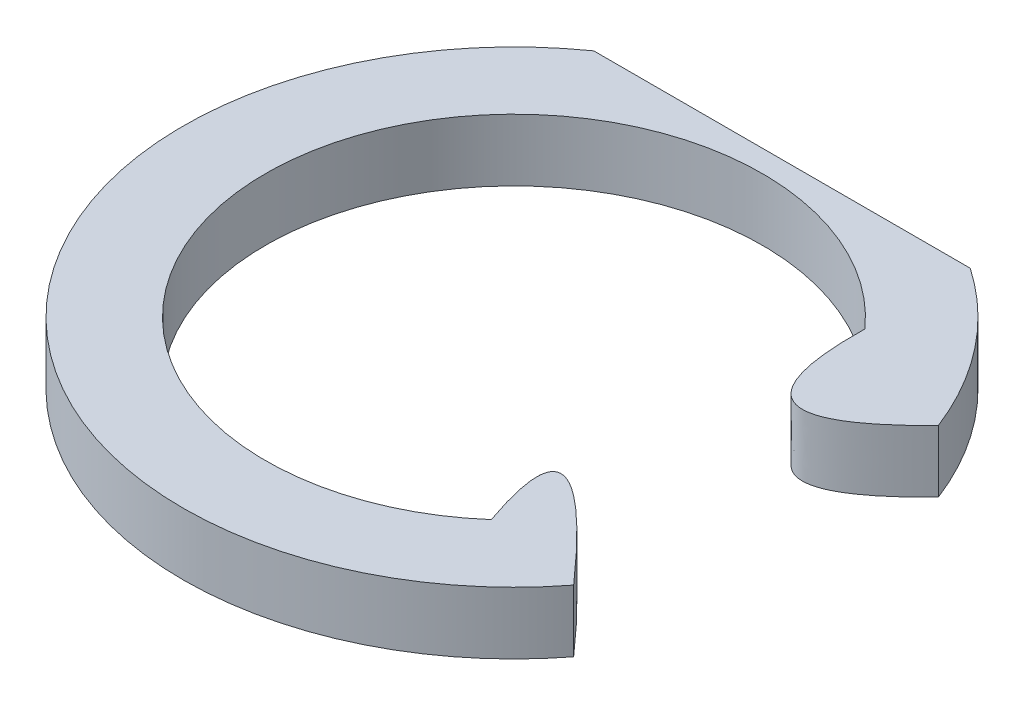
ISO-10303-21;
HEADER;
FILE_DESCRIPTION(('STEP AP214'),'2;1');
FILE_NAME('part.step','',(''),(''),'','','');
FILE_SCHEMA(('AUTOMOTIVE_DESIGN { 1 0 10303 214 1 1 1 1 }'));
ENDSEC;
DATA;
#1=APPLICATION_CONTEXT('core data for automotive mechanical design processes');
#2=APPLICATION_PROTOCOL_DEFINITION('international standard','automotive_design',2000,#1);
#3=PRODUCT_CONTEXT('',#1,'mechanical');
#4=PRODUCT('Part','Part','',(#3));
#5=PRODUCT_RELATED_PRODUCT_CATEGORY('part','',(#4));
#6=PRODUCT_DEFINITION_FORMATION('','',#4);
#7=PRODUCT_DEFINITION_CONTEXT('part definition',#1,'design');
#8=PRODUCT_DEFINITION('design','',#6,#7);
#9=PRODUCT_DEFINITION_SHAPE('','',#8);
#10=(LENGTH_UNIT() NAMED_UNIT(*) SI_UNIT(.MILLI.,.METRE.));
#11=(NAMED_UNIT(*) PLANE_ANGLE_UNIT() SI_UNIT($,.RADIAN.));
#12=(NAMED_UNIT(*) SI_UNIT($,.STERADIAN.) SOLID_ANGLE_UNIT());
#13=UNCERTAINTY_MEASURE_WITH_UNIT(LENGTH_MEASURE(1.E-05),#10,'distance_accuracy_value','');
#14=(GEOMETRIC_REPRESENTATION_CONTEXT(3) GLOBAL_UNCERTAINTY_ASSIGNED_CONTEXT((#13)) GLOBAL_UNIT_ASSIGNED_CONTEXT((#10,
#11,#12)) REPRESENTATION_CONTEXT('',''));
#15=CARTESIAN_POINT('',(0.,0.,0.));
#16=DIRECTION('',(0.,0.,1.));
#17=DIRECTION('',(1.,0.,0.));
#18=AXIS2_PLACEMENT_3D('',#15,#16,#17);
#19=CARTESIAN_POINT('',(9.24111421929395,-1.75,10.5167394179928));
#20=CARTESIAN_POINT('',(6.17315719615622,-1.75,1.69001653328734));
#21=CARTESIAN_POINT('',(14.7536304572527,-1.75,11.3915956316099));
#22=B_SPLINE_CURVE_WITH_KNOTS('',2,(#19,#20,#21),.UNSPECIFIED.,.F.,.F.,(3,3),(0.,1.),.UNSPECIFIED.);
#23=DIRECTION('',(0.,1.,0.));
#24=VECTOR('',#23,1.);
#25=SURFACE_OF_LINEAR_EXTRUSION('',#22,#24);
#26=CARTESIAN_POINT('',(9.24111421929395,1.75,10.5167394179928));
#27=CARTESIAN_POINT('',(6.17315719615622,1.75,1.69001653328734));
#28=CARTESIAN_POINT('',(14.7536304572527,1.75,11.3915956316099));
#29=B_SPLINE_CURVE_WITH_KNOTS('',2,(#26,#27,#28),.UNSPECIFIED.,.F.,.F.,(3,3),(0.,1.),.UNSPECIFIED.);
#30=CARTESIAN_POINT('',(9.24111421929395,1.75,10.5167394179928));
#31=VERTEX_POINT('',#30);
#32=CARTESIAN_POINT('',(14.7536304572527,1.75,11.3915956316099));
#33=VERTEX_POINT('',#32);
#34=EDGE_CURVE('E147',#31,#33,#29,.T.);
#35=ORIENTED_EDGE('',*,*,#34,.T.);
#36=DIRECTION('',(0.,1.,0.));
#37=VECTOR('',#36,1.);
#38=CARTESIAN_POINT('',(14.7536304572527,-1.75,11.3915956316099));
#39=LINE('',#38,#37);
#40=CARTESIAN_POINT('',(14.7536304572527,-1.75,11.3915956316099));
#41=VERTEX_POINT('',#40);
#42=EDGE_CURVE('E11',#41,#33,#39,.T.);
#43=ORIENTED_EDGE('',*,*,#42,.F.);
#44=CARTESIAN_POINT('',(9.24111421929395,-1.75,10.5167394179928));
#45=VERTEX_POINT('',#44);
#46=EDGE_CURVE('E163',#45,#41,#22,.T.);
#47=ORIENTED_EDGE('',*,*,#46,.F.);
#48=DIRECTION('',(0.,1.,0.));
#49=VECTOR('',#48,1.);
#50=CARTESIAN_POINT('',(9.24111421929395,-1.75,10.5167394179928));
#51=LINE('',#50,#49);
#52=EDGE_CURVE('E50',#45,#31,#51,.T.);
#53=ORIENTED_EDGE('',*,*,#52,.T.);
#54=EDGE_LOOP('',(#35,#43,#47,#53));
#55=FACE_BOUND('',#54,.T.);
#56=ADVANCED_FACE('F33',(#55),#25,.F.);
#57=CARTESIAN_POINT('',(0.,-1.75,0.));
#58=DIRECTION('',(0.,1.,0.));
#59=DIRECTION('',(0.,0.,1.));
#60=AXIS2_PLACEMENT_3D('',#57,#58,#59);
#61=CYLINDRICAL_SURFACE('',#60,18.6396905205878);
#62=CARTESIAN_POINT('',(0.,1.75,0.));
#63=DIRECTION('',(0.,-1.,0.));
#64=DIRECTION('',(0.,0.,-1.));
#65=AXIS2_PLACEMENT_3D('',#62,#63,#64);
#66=CIRCLE('',#65,18.6396905205878);
#67=CARTESIAN_POINT('',(-10.7395312194417,1.75,-15.234845975261));
#68=VERTEX_POINT('',#67);
#69=EDGE_CURVE('E141',#33,#68,#66,.T.);
#70=ORIENTED_EDGE('',*,*,#69,.T.);
#71=DIRECTION('',(0.,1.,0.));
#72=VECTOR('',#71,1.);
#73=CARTESIAN_POINT('',(-10.7395312194417,-1.75,-15.234845975261));
#74=LINE('',#73,#72);
#75=CARTESIAN_POINT('',(-10.7395312194417,-1.75,-15.234845975261));
#76=VERTEX_POINT('',#75);
#77=EDGE_CURVE('E42',#76,#68,#74,.T.);
#78=ORIENTED_EDGE('',*,*,#77,.F.);
#79=CARTESIAN_POINT('',(0.,-1.75,0.));
#80=DIRECTION('',(0.,-1.,0.));
#81=DIRECTION('',(0.,0.,-1.));
#82=AXIS2_PLACEMENT_3D('',#79,#80,#81);
#83=CIRCLE('',#82,18.6396905205878);
#84=EDGE_CURVE('E82',#41,#76,#83,.T.);
#85=ORIENTED_EDGE('',*,*,#84,.F.);
#86=ORIENTED_EDGE('',*,*,#42,.T.);
#87=EDGE_LOOP('',(#70,#78,#85,#86));
#88=FACE_BOUND('',#87,.T.);
#89=ADVANCED_FACE('F135',(#88),#61,.T.);
#90=CARTESIAN_POINT('',(-10.7395312194417,-1.75,-15.234845975261));
#91=DIRECTION('',(0.,0.,1.));
#92=DIRECTION('',(1.,0.,0.));
#93=AXIS2_PLACEMENT_3D('',#90,#91,#92);
#94=PLANE('',#93);
#95=DIRECTION('',(1.,0.,0.));
#96=VECTOR('',#95,1.);
#97=CARTESIAN_POINT('',(-10.7395312194417,1.75,-15.234845975261));
#98=LINE('',#97,#96);
#99=CARTESIAN_POINT('',(10.4645928855503,1.75,-15.234845975261));
#100=VERTEX_POINT('',#99);
#101=EDGE_CURVE('E146',#68,#100,#98,.T.);
#102=ORIENTED_EDGE('',*,*,#101,.T.);
#103=DIRECTION('',(0.,1.,0.));
#104=VECTOR('',#103,1.);
#105=CARTESIAN_POINT('',(10.4645928855503,-1.75,-15.234845975261));
#106=LINE('',#105,#104);
#107=CARTESIAN_POINT('',(10.4645928855503,-1.75,-15.234845975261));
#108=VERTEX_POINT('',#107);
#109=EDGE_CURVE('E111',#108,#100,#106,.T.);
#110=ORIENTED_EDGE('',*,*,#109,.F.);
#111=DIRECTION('',(1.,0.,0.));
#112=VECTOR('',#111,1.);
#113=CARTESIAN_POINT('',(-10.7395312194417,-1.75,-15.234845975261));
#114=LINE('',#113,#112);
#115=EDGE_CURVE('E99',#76,#108,#114,.T.);
#116=ORIENTED_EDGE('',*,*,#115,.F.);
#117=ORIENTED_EDGE('',*,*,#77,.T.);
#118=EDGE_LOOP('',(#102,#110,#116,#117));
#119=FACE_BOUND('',#118,.T.);
#120=ADVANCED_FACE('F133',(#119),#94,.F.);
#121=CARTESIAN_POINT('',(0.,-1.75,0.));
#122=DIRECTION('',(0.,1.,0.));
#123=DIRECTION('',(0.,0.,1.));
#124=AXIS2_PLACEMENT_3D('',#121,#122,#123);
#125=CYLINDRICAL_SURFACE('',#124,18.4826468924296);
#126=CARTESIAN_POINT('',(0.,1.75,0.));
#127=DIRECTION('',(0.,-1.,0.));
#128=DIRECTION('',(0.,0.,-1.));
#129=AXIS2_PLACEMENT_3D('',#126,#127,#128);
#130=CIRCLE('',#129,18.4826468924296);
#131=CARTESIAN_POINT('',(17.2375794047716,1.75,-6.66888989371031));
#132=VERTEX_POINT('',#131);
#133=EDGE_CURVE('E108',#100,#132,#130,.T.);
#134=ORIENTED_EDGE('',*,*,#133,.T.);
#135=DIRECTION('',(0.,1.,0.));
#136=VECTOR('',#135,1.);
#137=CARTESIAN_POINT('',(17.2375794047716,-1.75,-6.66888989371031));
#138=LINE('',#137,#136);
#139=CARTESIAN_POINT('',(17.2375794047716,-1.75,-6.66888989371031));
#140=VERTEX_POINT('',#139);
#141=EDGE_CURVE('E105',#140,#132,#138,.T.);
#142=ORIENTED_EDGE('',*,*,#141,.F.);
#143=CARTESIAN_POINT('',(0.,-1.75,0.));
#144=DIRECTION('',(0.,-1.,0.));
#145=DIRECTION('',(0.,0.,-1.));
#146=AXIS2_PLACEMENT_3D('',#143,#144,#145);
#147=CIRCLE('',#146,18.4826468924296);
#148=EDGE_CURVE('E92',#108,#140,#147,.T.);
#149=ORIENTED_EDGE('',*,*,#148,.F.);
#150=ORIENTED_EDGE('',*,*,#109,.T.);
#151=EDGE_LOOP('',(#134,#142,#149,#150));
#152=FACE_BOUND('',#151,.T.);
#153=ADVANCED_FACE('F106',(#152),#125,.T.);
#154=CARTESIAN_POINT('',(10.4645928855503,-1.75,-9.30012342604599));
#155=CARTESIAN_POINT('',(10.269158267033,-1.75,0.534114198664728));
#156=CARTESIAN_POINT('',(17.2375794047716,-1.75,-6.66888989371031));
#157=B_SPLINE_CURVE_WITH_KNOTS('',2,(#154,#155,#156),.UNSPECIFIED.,.F.,.F.,(3,3),(0.,1.),.UNSPECIFIED.);
#158=DIRECTION('',(0.,1.,0.));
#159=VECTOR('',#158,1.);
#160=SURFACE_OF_LINEAR_EXTRUSION('',#157,#159);
#161=CARTESIAN_POINT('',(10.4645928855503,1.75,-9.30012342604599));
#162=CARTESIAN_POINT('',(10.269158267033,1.75,0.534114198664728));
#163=CARTESIAN_POINT('',(17.2375794047716,1.75,-6.66888989371031));
#164=B_SPLINE_CURVE_WITH_KNOTS('',2,(#161,#162,#163),.UNSPECIFIED.,.F.,.F.,(3,3),(0.,1.),.UNSPECIFIED.);
#165=CARTESIAN_POINT('',(10.4645928855503,1.75,-9.30012342604599));
#166=VERTEX_POINT('',#165);
#167=EDGE_CURVE('E151',#166,#132,#164,.T.);
#168=ORIENTED_EDGE('',*,*,#167,.F.);
#169=DIRECTION('',(0.,1.,0.));
#170=VECTOR('',#169,1.);
#171=CARTESIAN_POINT('',(10.4645928855503,-1.75,-9.30012342604599));
#172=LINE('',#171,#170);
#173=CARTESIAN_POINT('',(10.4645928855503,-1.75,-9.30012342604599));
#174=VERTEX_POINT('',#173);
#175=EDGE_CURVE('E70',#174,#166,#172,.T.);
#176=ORIENTED_EDGE('',*,*,#175,.F.);
#177=EDGE_CURVE('E97',#174,#140,#157,.T.);
#178=ORIENTED_EDGE('',*,*,#177,.T.);
#179=ORIENTED_EDGE('',*,*,#141,.T.);
#180=EDGE_LOOP('',(#168,#176,#178,#179));
#181=FACE_BOUND('',#180,.T.);
#182=ADVANCED_FACE('F113',(#181),#160,.T.);
#183=CARTESIAN_POINT('',(0.,-1.75,0.));
#184=DIRECTION('',(0.,1.,0.));
#185=DIRECTION('',(0.,0.,1.));
#186=AXIS2_PLACEMENT_3D('',#183,#184,#185);
#187=CYLINDRICAL_SURFACE('',#186,14.);
#188=CARTESIAN_POINT('',(0.,1.75,0.));
#189=DIRECTION('',(0.,-1.,0.));
#190=DIRECTION('',(0.,0.,-1.));
#191=AXIS2_PLACEMENT_3D('',#188,#189,#190);
#192=CIRCLE('',#191,14.);
#193=EDGE_CURVE('E157',#31,#166,#192,.T.);
#194=ORIENTED_EDGE('',*,*,#193,.F.);
#195=ORIENTED_EDGE('',*,*,#52,.F.);
#196=CARTESIAN_POINT('',(0.,-1.75,0.));
#197=DIRECTION('',(0.,-1.,0.));
#198=DIRECTION('',(0.,0.,-1.));
#199=AXIS2_PLACEMENT_3D('',#196,#197,#198);
#200=CIRCLE('',#199,14.);
#201=EDGE_CURVE('E114',#45,#174,#200,.T.);
#202=ORIENTED_EDGE('',*,*,#201,.T.);
#203=ORIENTED_EDGE('',*,*,#175,.T.);
#204=EDGE_LOOP('',(#194,#195,#202,#203));
#205=FACE_BOUND('',#204,.T.);
#206=ADVANCED_FACE('F129',(#205),#187,.F.);
#207=CARTESIAN_POINT('',(9.08526476721478,-1.75,6.32209202904435));
#208=DIRECTION('',(0.,1.,0.));
#209=DIRECTION('',(0.,0.,1.));
#210=AXIS2_PLACEMENT_3D('',#207,#208,#209);
#211=PLANE('',#210);
#212=ORIENTED_EDGE('',*,*,#46,.T.);
#213=ORIENTED_EDGE('',*,*,#84,.T.);
#214=ORIENTED_EDGE('',*,*,#115,.T.);
#215=ORIENTED_EDGE('',*,*,#148,.T.);
#216=ORIENTED_EDGE('',*,*,#177,.F.);
#217=ORIENTED_EDGE('',*,*,#201,.F.);
#218=EDGE_LOOP('',(#212,#213,#214,#215,#216,#217));
#219=FACE_BOUND('',#218,.T.);
#220=ADVANCED_FACE('F94',(#219),#211,.F.);
#221=CARTESIAN_POINT('',(9.08526476721478,1.75,6.32209202904435));
#222=DIRECTION('',(0.,1.,0.));
#223=DIRECTION('',(0.,0.,1.));
#224=AXIS2_PLACEMENT_3D('',#221,#222,#223);
#225=PLANE('',#224);
#226=ORIENTED_EDGE('',*,*,#34,.F.);
#227=ORIENTED_EDGE('',*,*,#193,.T.);
#228=ORIENTED_EDGE('',*,*,#167,.T.);
#229=ORIENTED_EDGE('',*,*,#133,.F.);
#230=ORIENTED_EDGE('',*,*,#101,.F.);
#231=ORIENTED_EDGE('',*,*,#69,.F.);
#232=EDGE_LOOP('',(#226,#227,#228,#229,#230,#231));
#233=FACE_BOUND('',#232,.T.);
#234=ADVANCED_FACE('F149',(#233),#225,.T.);
#235=CLOSED_SHELL('',(#56,#89,#120,#153,#182,#206,#220,#234));
#236=MANIFOLD_SOLID_BREP('B2',#235);
#237=ADVANCED_BREP_SHAPE_REPRESENTATION('',(#18,#236),#14);
#238=SHAPE_DEFINITION_REPRESENTATION(#9,#237);
ENDSEC;
END-ISO-10303-21;
